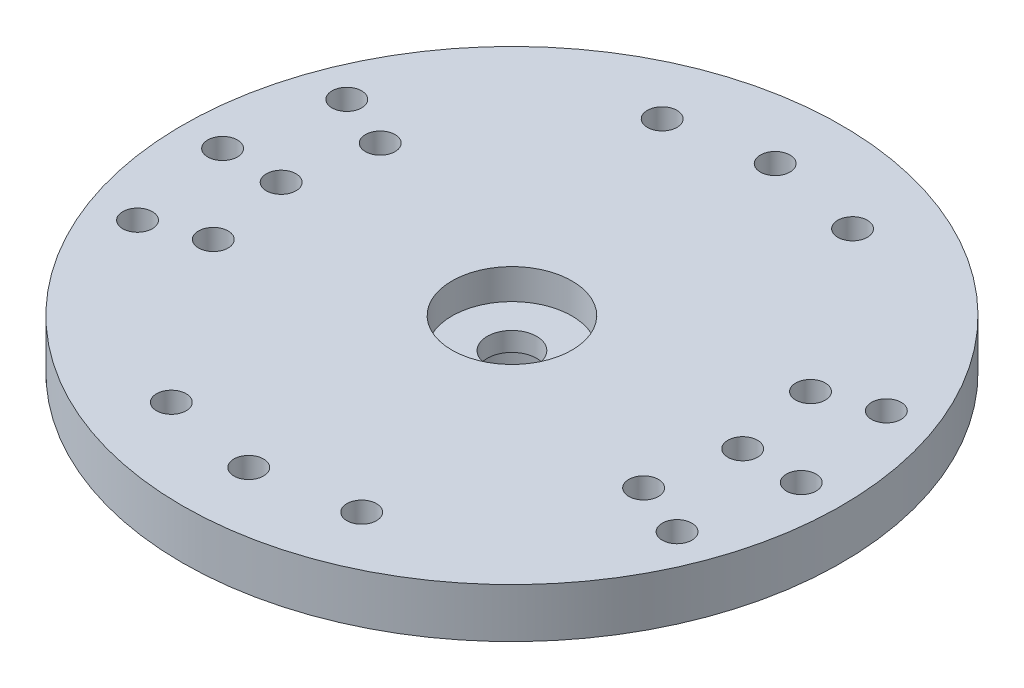
ISO-10303-21;
HEADER;
FILE_DESCRIPTION(('STEP AP214'),'2;1');
FILE_NAME('part.step','',(''),(''),'','','');
FILE_SCHEMA(('AUTOMOTIVE_DESIGN { 1 0 10303 214 1 1 1 1 }'));
ENDSEC;
DATA;
#1=APPLICATION_CONTEXT('core data for automotive mechanical design processes');
#2=APPLICATION_PROTOCOL_DEFINITION('international standard','automotive_design',2000,#1);
#3=PRODUCT_CONTEXT('',#1,'mechanical');
#4=PRODUCT('Part','Part','',(#3));
#5=PRODUCT_RELATED_PRODUCT_CATEGORY('part','',(#4));
#6=PRODUCT_DEFINITION_FORMATION('','',#4);
#7=PRODUCT_DEFINITION_CONTEXT('part definition',#1,'design');
#8=PRODUCT_DEFINITION('design','',#6,#7);
#9=PRODUCT_DEFINITION_SHAPE('','',#8);
#10=(LENGTH_UNIT() NAMED_UNIT(*) SI_UNIT(.MILLI.,.METRE.));
#11=(NAMED_UNIT(*) PLANE_ANGLE_UNIT() SI_UNIT($,.RADIAN.));
#12=(NAMED_UNIT(*) SI_UNIT($,.STERADIAN.) SOLID_ANGLE_UNIT());
#13=UNCERTAINTY_MEASURE_WITH_UNIT(LENGTH_MEASURE(1.E-05),#10,'distance_accuracy_value','');
#14=(GEOMETRIC_REPRESENTATION_CONTEXT(3) GLOBAL_UNCERTAINTY_ASSIGNED_CONTEXT((#13)) GLOBAL_UNIT_ASSIGNED_CONTEXT((#10,
#11,#12)) REPRESENTATION_CONTEXT('',''));
#15=CARTESIAN_POINT('',(0.,0.,0.));
#16=DIRECTION('',(0.,0.,1.));
#17=DIRECTION('',(1.,0.,0.));
#18=AXIS2_PLACEMENT_3D('',#15,#16,#17);
#19=CARTESIAN_POINT('',(0.,0.,0.));
#20=DIRECTION('',(0.,1.,0.));
#21=DIRECTION('',(0.,0.,1.));
#22=AXIS2_PLACEMENT_3D('',#19,#20,#21);
#23=PLANE('',#22);
#24=CARTESIAN_POINT('',(0.,0.,9.4742));
#25=DIRECTION('',(0.,1.,0.));
#26=DIRECTION('',(0.,0.,1.));
#27=AXIS2_PLACEMENT_3D('',#24,#25,#26);
#28=CIRCLE('',#27,0.5334);
#29=CARTESIAN_POINT('',(0.,0.,10.0076));
#30=VERTEX_POINT('',#29);
#31=EDGE_CURVE('E164',#30,#30,#28,.F.);
#32=ORIENTED_EDGE('',*,*,#31,.F.);
#33=EDGE_LOOP('',(#32));
#34=FACE_BOUND('',#33,.T.);
#35=CARTESIAN_POINT('',(-9.70922006586347,0.,-3.76595827282167));
#36=DIRECTION('',(0.,1.,0.));
#37=DIRECTION('',(0.,0.,1.));
#38=AXIS2_PLACEMENT_3D('',#35,#36,#37);
#39=CIRCLE('',#38,0.533399999999999);
#40=CARTESIAN_POINT('',(-9.70922006586347,0.,-3.23255827282167));
#41=VERTEX_POINT('',#40);
#42=EDGE_CURVE('E98',#41,#41,#39,.F.);
#43=ORIENTED_EDGE('',*,*,#42,.F.);
#44=EDGE_LOOP('',(#43));
#45=FACE_BOUND('',#44,.T.);
#46=CARTESIAN_POINT('',(-8.3058,0.,0.));
#47=DIRECTION('',(0.,1.,0.));
#48=DIRECTION('',(0.,0.,1.));
#49=AXIS2_PLACEMENT_3D('',#46,#47,#48);
#50=CIRCLE('',#49,0.5334);
#51=CARTESIAN_POINT('',(-8.3058,0.,0.5334));
#52=VERTEX_POINT('',#51);
#53=EDGE_CURVE('E86',#52,#52,#50,.F.);
#54=ORIENTED_EDGE('',*,*,#53,.F.);
#55=EDGE_LOOP('',(#54));
#56=FACE_BOUND('',#55,.T.);
#57=CARTESIAN_POINT('',(-9.7092200658532,0.,3.76595827284817));
#58=DIRECTION('',(0.,1.,0.));
#59=DIRECTION('',(0.,0.,1.));
#60=AXIS2_PLACEMENT_3D('',#57,#58,#59);
#61=CIRCLE('',#60,0.5334);
#62=CARTESIAN_POINT('',(-9.7092200658532,0.,4.29935827284817));
#63=VERTEX_POINT('',#62);
#64=EDGE_CURVE('E74',#63,#63,#61,.F.);
#65=ORIENTED_EDGE('',*,*,#64,.F.);
#66=EDGE_LOOP('',(#65));
#67=FACE_BOUND('',#66,.T.);
#68=CARTESIAN_POINT('',(0.,0.,0.));
#69=DIRECTION('',(0.,1.,0.));
#70=DIRECTION('',(0.,0.,1.));
#71=AXIS2_PLACEMENT_3D('',#68,#69,#70);
#72=CIRCLE('',#71,3.4417);
#73=CARTESIAN_POINT('',(0.,0.,3.4417));
#74=VERTEX_POINT('',#73);
#75=EDGE_CURVE('E10',#74,#74,#72,.F.);
#76=ORIENTED_EDGE('',*,*,#75,.F.);
#77=EDGE_LOOP('',(#76));
#78=FACE_BOUND('',#77,.T.);
#79=CARTESIAN_POINT('',(0.,0.,0.));
#80=DIRECTION('',(0.,1.,0.));
#81=DIRECTION('',(0.,0.,1.));
#82=AXIS2_PLACEMENT_3D('',#79,#80,#81);
#83=CIRCLE('',#82,11.8618);
#84=CARTESIAN_POINT('',(0.,0.,11.8618));
#85=VERTEX_POINT('',#84);
#86=EDGE_CURVE('E41',#85,#85,#83,.T.);
#87=ORIENTED_EDGE('',*,*,#86,.F.);
#88=EDGE_LOOP('',(#87));
#89=FACE_BOUND('',#88,.T.);
#90=CARTESIAN_POINT('',(-10.414,0.,0.));
#91=DIRECTION('',(0.,1.,0.));
#92=DIRECTION('',(0.,0.,1.));
#93=AXIS2_PLACEMENT_3D('',#90,#91,#92);
#94=CIRCLE('',#93,0.5334);
#95=CARTESIAN_POINT('',(-10.414,0.,0.5334));
#96=VERTEX_POINT('',#95);
#97=EDGE_CURVE('E64',#96,#96,#94,.F.);
#98=ORIENTED_EDGE('',*,*,#97,.F.);
#99=EDGE_LOOP('',(#98));
#100=FACE_BOUND('',#99,.T.);
#101=CARTESIAN_POINT('',(-7.74369502813066,0.,3.0035813542011));
#102=DIRECTION('',(0.,1.,0.));
#103=DIRECTION('',(0.,0.,1.));
#104=AXIS2_PLACEMENT_3D('',#101,#102,#103);
#105=CIRCLE('',#104,0.5334);
#106=CARTESIAN_POINT('',(-7.74369502813066,0.,3.5369813542011));
#107=VERTEX_POINT('',#106);
#108=EDGE_CURVE('E80',#107,#107,#105,.F.);
#109=ORIENTED_EDGE('',*,*,#108,.F.);
#110=EDGE_LOOP('',(#109));
#111=FACE_BOUND('',#110,.T.);
#112=CARTESIAN_POINT('',(-7.74369502814094,0.,-3.0035813541746));
#113=DIRECTION('',(0.,1.,0.));
#114=DIRECTION('',(0.,0.,1.));
#115=AXIS2_PLACEMENT_3D('',#112,#113,#114);
#116=CIRCLE('',#115,0.5334);
#117=CARTESIAN_POINT('',(-7.74369502814094,0.,-2.4701813541746));
#118=VERTEX_POINT('',#117);
#119=EDGE_CURVE('E92',#118,#118,#116,.F.);
#120=ORIENTED_EDGE('',*,*,#119,.F.);
#121=EDGE_LOOP('',(#120));
#122=FACE_BOUND('',#121,.T.);
#123=CARTESIAN_POINT('',(-3.42578011314545,0.,-8.83314758488599));
#124=DIRECTION('',(0.,1.,0.));
#125=DIRECTION('',(0.,0.,1.));
#126=AXIS2_PLACEMENT_3D('',#123,#124,#125);
#127=CIRCLE('',#126,0.533400000000001);
#128=CARTESIAN_POINT('',(-3.42578011314545,0.,-8.29974758488599));
#129=VERTEX_POINT('',#128);
#130=EDGE_CURVE('E104',#129,#129,#127,.T.);
#131=ORIENTED_EDGE('',*,*,#130,.T.);
#132=EDGE_LOOP('',(#131));
#133=FACE_BOUND('',#132,.T.);
#134=CARTESIAN_POINT('',(0.,0.,-9.4742));
#135=DIRECTION('',(0.,1.,0.));
#136=DIRECTION('',(0.,0.,1.));
#137=AXIS2_PLACEMENT_3D('',#134,#135,#136);
#138=CIRCLE('',#137,0.5334);
#139=CARTESIAN_POINT('',(0.,0.,-8.9408));
#140=VERTEX_POINT('',#139);
#141=EDGE_CURVE('E110',#140,#140,#138,.T.);
#142=ORIENTED_EDGE('',*,*,#141,.T.);
#143=EDGE_LOOP('',(#142));
#144=FACE_BOUND('',#143,.T.);
#145=CARTESIAN_POINT('',(3.42578011314545,0.,-8.83314758488599));
#146=DIRECTION('',(0.,1.,0.));
#147=DIRECTION('',(0.,0.,1.));
#148=AXIS2_PLACEMENT_3D('',#145,#146,#147);
#149=CIRCLE('',#148,0.533400000000001);
#150=CARTESIAN_POINT('',(3.42578011314545,0.,-8.29974758488599));
#151=VERTEX_POINT('',#150);
#152=EDGE_CURVE('E116',#151,#151,#149,.T.);
#153=ORIENTED_EDGE('',*,*,#152,.T.);
#154=EDGE_LOOP('',(#153));
#155=FACE_BOUND('',#154,.T.);
#156=CARTESIAN_POINT('',(7.74369502814094,0.,-3.0035813541746));
#157=DIRECTION('',(0.,1.,0.));
#158=DIRECTION('',(0.,0.,1.));
#159=AXIS2_PLACEMENT_3D('',#156,#157,#158);
#160=CIRCLE('',#159,0.5334);
#161=CARTESIAN_POINT('',(7.74369502814094,0.,-2.4701813541746));
#162=VERTEX_POINT('',#161);
#163=EDGE_CURVE('E122',#162,#162,#160,.T.);
#164=ORIENTED_EDGE('',*,*,#163,.T.);
#165=EDGE_LOOP('',(#164));
#166=FACE_BOUND('',#165,.T.);
#167=CARTESIAN_POINT('',(9.70922006586347,0.,-3.76595827282167));
#168=DIRECTION('',(0.,1.,0.));
#169=DIRECTION('',(0.,0.,1.));
#170=AXIS2_PLACEMENT_3D('',#167,#168,#169);
#171=CIRCLE('',#170,0.533399999999999);
#172=CARTESIAN_POINT('',(9.70922006586347,0.,-3.23255827282167));
#173=VERTEX_POINT('',#172);
#174=EDGE_CURVE('E128',#173,#173,#171,.T.);
#175=ORIENTED_EDGE('',*,*,#174,.T.);
#176=EDGE_LOOP('',(#175));
#177=FACE_BOUND('',#176,.T.);
#178=CARTESIAN_POINT('',(10.414,0.,0.));
#179=DIRECTION('',(0.,1.,0.));
#180=DIRECTION('',(0.,0.,1.));
#181=AXIS2_PLACEMENT_3D('',#178,#179,#180);
#182=CIRCLE('',#181,0.5334);
#183=CARTESIAN_POINT('',(10.414,0.,0.5334));
#184=VERTEX_POINT('',#183);
#185=EDGE_CURVE('E134',#184,#184,#182,.T.);
#186=ORIENTED_EDGE('',*,*,#185,.T.);
#187=EDGE_LOOP('',(#186));
#188=FACE_BOUND('',#187,.T.);
#189=CARTESIAN_POINT('',(8.3058,0.,0.));
#190=DIRECTION('',(0.,1.,0.));
#191=DIRECTION('',(0.,0.,1.));
#192=AXIS2_PLACEMENT_3D('',#189,#190,#191);
#193=CIRCLE('',#192,0.5334);
#194=CARTESIAN_POINT('',(8.3058,0.,0.5334));
#195=VERTEX_POINT('',#194);
#196=EDGE_CURVE('E140',#195,#195,#193,.T.);
#197=ORIENTED_EDGE('',*,*,#196,.T.);
#198=EDGE_LOOP('',(#197));
#199=FACE_BOUND('',#198,.T.);
#200=CARTESIAN_POINT('',(7.74369502813066,0.,3.0035813542011));
#201=DIRECTION('',(0.,1.,0.));
#202=DIRECTION('',(0.,0.,1.));
#203=AXIS2_PLACEMENT_3D('',#200,#201,#202);
#204=CIRCLE('',#203,0.5334);
#205=CARTESIAN_POINT('',(7.74369502813066,0.,3.5369813542011));
#206=VERTEX_POINT('',#205);
#207=EDGE_CURVE('E146',#206,#206,#204,.T.);
#208=ORIENTED_EDGE('',*,*,#207,.T.);
#209=EDGE_LOOP('',(#208));
#210=FACE_BOUND('',#209,.T.);
#211=CARTESIAN_POINT('',(9.7092200658532,0.,3.76595827284817));
#212=DIRECTION('',(0.,1.,0.));
#213=DIRECTION('',(0.,0.,1.));
#214=AXIS2_PLACEMENT_3D('',#211,#212,#213);
#215=CIRCLE('',#214,0.5334);
#216=CARTESIAN_POINT('',(9.7092200658532,0.,4.29935827284817));
#217=VERTEX_POINT('',#216);
#218=EDGE_CURVE('E152',#217,#217,#215,.T.);
#219=ORIENTED_EDGE('',*,*,#218,.T.);
#220=EDGE_LOOP('',(#219));
#221=FACE_BOUND('',#220,.T.);
#222=CARTESIAN_POINT('',(-3.42578011314545,0.,8.83314758488599));
#223=DIRECTION('',(0.,1.,0.));
#224=DIRECTION('',(0.,0.,1.));
#225=AXIS2_PLACEMENT_3D('',#222,#223,#224);
#226=CIRCLE('',#225,0.533400000000001);
#227=CARTESIAN_POINT('',(-3.42578011314545,0.,9.36654758488599));
#228=VERTEX_POINT('',#227);
#229=EDGE_CURVE('E158',#228,#228,#226,.F.);
#230=ORIENTED_EDGE('',*,*,#229,.F.);
#231=EDGE_LOOP('',(#230));
#232=FACE_BOUND('',#231,.T.);
#233=CARTESIAN_POINT('',(3.42578011314545,0.,8.83314758488599));
#234=DIRECTION('',(0.,1.,0.));
#235=DIRECTION('',(0.,0.,1.));
#236=AXIS2_PLACEMENT_3D('',#233,#234,#235);
#237=CIRCLE('',#236,0.533400000000001);
#238=CARTESIAN_POINT('',(3.42578011314545,0.,9.36654758488599));
#239=VERTEX_POINT('',#238);
#240=EDGE_CURVE('E170',#239,#239,#237,.F.);
#241=ORIENTED_EDGE('',*,*,#240,.F.);
#242=EDGE_LOOP('',(#241));
#243=FACE_BOUND('',#242,.T.);
#244=ADVANCED_FACE('F30',(#34,#45,#56,#67,#78,#89,#100,#111,#122,#133,#144,#155,#166,#177,#188,
#199,#210,#221,#232,#243),#23,.F.);
#245=CARTESIAN_POINT('',(0.,1.778,0.));
#246=DIRECTION('',(0.,1.,0.));
#247=DIRECTION('',(0.,0.,1.));
#248=AXIS2_PLACEMENT_3D('',#245,#246,#247);
#249=PLANE('',#248);
#250=CARTESIAN_POINT('',(0.,1.778,9.4742));
#251=DIRECTION('',(0.,-1.,0.));
#252=DIRECTION('',(0.,0.,-1.));
#253=AXIS2_PLACEMENT_3D('',#250,#251,#252);
#254=CIRCLE('',#253,0.5334);
#255=CARTESIAN_POINT('',(0.,1.778,8.9408));
#256=VERTEX_POINT('',#255);
#257=EDGE_CURVE('E167',#256,#256,#254,.T.);
#258=ORIENTED_EDGE('',*,*,#257,.T.);
#259=EDGE_LOOP('',(#258));
#260=FACE_BOUND('',#259,.T.);
#261=CARTESIAN_POINT('',(-9.70922006586347,1.778,-3.76595827282167));
#262=DIRECTION('',(0.,-1.,0.));
#263=DIRECTION('',(0.,0.,-1.));
#264=AXIS2_PLACEMENT_3D('',#261,#262,#263);
#265=CIRCLE('',#264,0.533399999999999);
#266=CARTESIAN_POINT('',(-9.70922006586347,1.778,-4.29935827282167));
#267=VERTEX_POINT('',#266);
#268=EDGE_CURVE('E101',#267,#267,#265,.T.);
#269=ORIENTED_EDGE('',*,*,#268,.T.);
#270=EDGE_LOOP('',(#269));
#271=FACE_BOUND('',#270,.T.);
#272=CARTESIAN_POINT('',(-8.3058,1.778,0.));
#273=DIRECTION('',(0.,-1.,0.));
#274=DIRECTION('',(0.,0.,-1.));
#275=AXIS2_PLACEMENT_3D('',#272,#273,#274);
#276=CIRCLE('',#275,0.5334);
#277=CARTESIAN_POINT('',(-8.3058,1.778,-0.5334));
#278=VERTEX_POINT('',#277);
#279=EDGE_CURVE('E89',#278,#278,#276,.T.);
#280=ORIENTED_EDGE('',*,*,#279,.T.);
#281=EDGE_LOOP('',(#280));
#282=FACE_BOUND('',#281,.T.);
#283=CARTESIAN_POINT('',(-9.7092200658532,1.778,3.76595827284817));
#284=DIRECTION('',(0.,-1.,0.));
#285=DIRECTION('',(0.,0.,-1.));
#286=AXIS2_PLACEMENT_3D('',#283,#284,#285);
#287=CIRCLE('',#286,0.5334);
#288=CARTESIAN_POINT('',(-9.7092200658532,1.778,3.23255827284817));
#289=VERTEX_POINT('',#288);
#290=EDGE_CURVE('E77',#289,#289,#287,.T.);
#291=ORIENTED_EDGE('',*,*,#290,.T.);
#292=EDGE_LOOP('',(#291));
#293=FACE_BOUND('',#292,.T.);
#294=CARTESIAN_POINT('',(0.,1.778,0.));
#295=DIRECTION('',(0.,1.,0.));
#296=DIRECTION('',(0.,0.,1.));
#297=AXIS2_PLACEMENT_3D('',#294,#295,#296);
#298=CIRCLE('',#297,11.8618);
#299=CARTESIAN_POINT('',(0.,1.778,11.8618));
#300=VERTEX_POINT('',#299);
#301=EDGE_CURVE('E37',#300,#300,#298,.T.);
#302=ORIENTED_EDGE('',*,*,#301,.T.);
#303=EDGE_LOOP('',(#302));
#304=FACE_BOUND('',#303,.T.);
#305=CARTESIAN_POINT('',(0.,1.778,0.));
#306=DIRECTION('',(0.,1.,0.));
#307=DIRECTION('',(0.,0.,1.));
#308=AXIS2_PLACEMENT_3D('',#305,#306,#307);
#309=CIRCLE('',#308,2.159);
#310=CARTESIAN_POINT('',(0.,1.778,2.159));
#311=VERTEX_POINT('',#310);
#312=EDGE_CURVE('E60',#311,#311,#309,.T.);
#313=ORIENTED_EDGE('',*,*,#312,.F.);
#314=EDGE_LOOP('',(#313));
#315=FACE_BOUND('',#314,.T.);
#316=CARTESIAN_POINT('',(-10.414,1.778,0.));
#317=DIRECTION('',(0.,-1.,0.));
#318=DIRECTION('',(0.,0.,-1.));
#319=AXIS2_PLACEMENT_3D('',#316,#317,#318);
#320=CIRCLE('',#319,0.5334);
#321=CARTESIAN_POINT('',(-10.414,1.778,-0.5334));
#322=VERTEX_POINT('',#321);
#323=EDGE_CURVE('E71',#322,#322,#320,.T.);
#324=ORIENTED_EDGE('',*,*,#323,.T.);
#325=EDGE_LOOP('',(#324));
#326=FACE_BOUND('',#325,.T.);
#327=CARTESIAN_POINT('',(-7.74369502813066,1.778,3.0035813542011));
#328=DIRECTION('',(0.,-1.,0.));
#329=DIRECTION('',(0.,0.,-1.));
#330=AXIS2_PLACEMENT_3D('',#327,#328,#329);
#331=CIRCLE('',#330,0.5334);
#332=CARTESIAN_POINT('',(-7.74369502813066,1.778,2.4701813542011));
#333=VERTEX_POINT('',#332);
#334=EDGE_CURVE('E83',#333,#333,#331,.T.);
#335=ORIENTED_EDGE('',*,*,#334,.T.);
#336=EDGE_LOOP('',(#335));
#337=FACE_BOUND('',#336,.T.);
#338=CARTESIAN_POINT('',(-7.74369502814094,1.778,-3.0035813541746));
#339=DIRECTION('',(0.,-1.,0.));
#340=DIRECTION('',(0.,0.,-1.));
#341=AXIS2_PLACEMENT_3D('',#338,#339,#340);
#342=CIRCLE('',#341,0.5334);
#343=CARTESIAN_POINT('',(-7.74369502814094,1.778,-3.5369813541746));
#344=VERTEX_POINT('',#343);
#345=EDGE_CURVE('E95',#344,#344,#342,.T.);
#346=ORIENTED_EDGE('',*,*,#345,.T.);
#347=EDGE_LOOP('',(#346));
#348=FACE_BOUND('',#347,.T.);
#349=CARTESIAN_POINT('',(-3.42578011314545,1.778,-8.83314758488599));
#350=DIRECTION('',(0.,1.,0.));
#351=DIRECTION('',(0.,0.,1.));
#352=AXIS2_PLACEMENT_3D('',#349,#350,#351);
#353=CIRCLE('',#352,0.533400000000001);
#354=CARTESIAN_POINT('',(-3.42578011314545,1.778,-8.29974758488599));
#355=VERTEX_POINT('',#354);
#356=EDGE_CURVE('E107',#355,#355,#353,.T.);
#357=ORIENTED_EDGE('',*,*,#356,.F.);
#358=EDGE_LOOP('',(#357));
#359=FACE_BOUND('',#358,.T.);
#360=CARTESIAN_POINT('',(0.,1.778,-9.4742));
#361=DIRECTION('',(0.,1.,0.));
#362=DIRECTION('',(0.,0.,1.));
#363=AXIS2_PLACEMENT_3D('',#360,#361,#362);
#364=CIRCLE('',#363,0.5334);
#365=CARTESIAN_POINT('',(0.,1.778,-8.9408));
#366=VERTEX_POINT('',#365);
#367=EDGE_CURVE('E113',#366,#366,#364,.T.);
#368=ORIENTED_EDGE('',*,*,#367,.F.);
#369=EDGE_LOOP('',(#368));
#370=FACE_BOUND('',#369,.T.);
#371=CARTESIAN_POINT('',(3.42578011314545,1.778,-8.83314758488599));
#372=DIRECTION('',(0.,1.,0.));
#373=DIRECTION('',(0.,0.,1.));
#374=AXIS2_PLACEMENT_3D('',#371,#372,#373);
#375=CIRCLE('',#374,0.533400000000001);
#376=CARTESIAN_POINT('',(3.42578011314545,1.778,-8.29974758488599));
#377=VERTEX_POINT('',#376);
#378=EDGE_CURVE('E119',#377,#377,#375,.T.);
#379=ORIENTED_EDGE('',*,*,#378,.F.);
#380=EDGE_LOOP('',(#379));
#381=FACE_BOUND('',#380,.T.);
#382=CARTESIAN_POINT('',(7.74369502814094,1.778,-3.0035813541746));
#383=DIRECTION('',(0.,1.,0.));
#384=DIRECTION('',(0.,0.,1.));
#385=AXIS2_PLACEMENT_3D('',#382,#383,#384);
#386=CIRCLE('',#385,0.5334);
#387=CARTESIAN_POINT('',(7.74369502814094,1.778,-2.4701813541746));
#388=VERTEX_POINT('',#387);
#389=EDGE_CURVE('E125',#388,#388,#386,.T.);
#390=ORIENTED_EDGE('',*,*,#389,.F.);
#391=EDGE_LOOP('',(#390));
#392=FACE_BOUND('',#391,.T.);
#393=CARTESIAN_POINT('',(9.70922006586347,1.778,-3.76595827282167));
#394=DIRECTION('',(0.,1.,0.));
#395=DIRECTION('',(0.,0.,1.));
#396=AXIS2_PLACEMENT_3D('',#393,#394,#395);
#397=CIRCLE('',#396,0.533399999999999);
#398=CARTESIAN_POINT('',(9.70922006586347,1.778,-3.23255827282167));
#399=VERTEX_POINT('',#398);
#400=EDGE_CURVE('E131',#399,#399,#397,.T.);
#401=ORIENTED_EDGE('',*,*,#400,.F.);
#402=EDGE_LOOP('',(#401));
#403=FACE_BOUND('',#402,.T.);
#404=CARTESIAN_POINT('',(10.414,1.778,0.));
#405=DIRECTION('',(0.,1.,0.));
#406=DIRECTION('',(0.,0.,1.));
#407=AXIS2_PLACEMENT_3D('',#404,#405,#406);
#408=CIRCLE('',#407,0.5334);
#409=CARTESIAN_POINT('',(10.414,1.778,0.5334));
#410=VERTEX_POINT('',#409);
#411=EDGE_CURVE('E137',#410,#410,#408,.T.);
#412=ORIENTED_EDGE('',*,*,#411,.F.);
#413=EDGE_LOOP('',(#412));
#414=FACE_BOUND('',#413,.T.);
#415=CARTESIAN_POINT('',(8.3058,1.778,0.));
#416=DIRECTION('',(0.,1.,0.));
#417=DIRECTION('',(0.,0.,1.));
#418=AXIS2_PLACEMENT_3D('',#415,#416,#417);
#419=CIRCLE('',#418,0.5334);
#420=CARTESIAN_POINT('',(8.3058,1.778,0.5334));
#421=VERTEX_POINT('',#420);
#422=EDGE_CURVE('E143',#421,#421,#419,.T.);
#423=ORIENTED_EDGE('',*,*,#422,.F.);
#424=EDGE_LOOP('',(#423));
#425=FACE_BOUND('',#424,.T.);
#426=CARTESIAN_POINT('',(7.74369502813066,1.778,3.0035813542011));
#427=DIRECTION('',(0.,1.,0.));
#428=DIRECTION('',(0.,0.,1.));
#429=AXIS2_PLACEMENT_3D('',#426,#427,#428);
#430=CIRCLE('',#429,0.5334);
#431=CARTESIAN_POINT('',(7.74369502813066,1.778,3.5369813542011));
#432=VERTEX_POINT('',#431);
#433=EDGE_CURVE('E149',#432,#432,#430,.T.);
#434=ORIENTED_EDGE('',*,*,#433,.F.);
#435=EDGE_LOOP('',(#434));
#436=FACE_BOUND('',#435,.T.);
#437=CARTESIAN_POINT('',(9.7092200658532,1.778,3.76595827284817));
#438=DIRECTION('',(0.,1.,0.));
#439=DIRECTION('',(0.,0.,1.));
#440=AXIS2_PLACEMENT_3D('',#437,#438,#439);
#441=CIRCLE('',#440,0.5334);
#442=CARTESIAN_POINT('',(9.7092200658532,1.778,4.29935827284817));
#443=VERTEX_POINT('',#442);
#444=EDGE_CURVE('E155',#443,#443,#441,.T.);
#445=ORIENTED_EDGE('',*,*,#444,.F.);
#446=EDGE_LOOP('',(#445));
#447=FACE_BOUND('',#446,.T.);
#448=CARTESIAN_POINT('',(-3.42578011314545,1.778,8.83314758488599));
#449=DIRECTION('',(0.,-1.,0.));
#450=DIRECTION('',(0.,0.,-1.));
#451=AXIS2_PLACEMENT_3D('',#448,#449,#450);
#452=CIRCLE('',#451,0.533400000000001);
#453=CARTESIAN_POINT('',(-3.42578011314545,1.778,8.29974758488599));
#454=VERTEX_POINT('',#453);
#455=EDGE_CURVE('E161',#454,#454,#452,.T.);
#456=ORIENTED_EDGE('',*,*,#455,.T.);
#457=EDGE_LOOP('',(#456));
#458=FACE_BOUND('',#457,.T.);
#459=CARTESIAN_POINT('',(3.42578011314545,1.778,8.83314758488599));
#460=DIRECTION('',(0.,-1.,0.));
#461=DIRECTION('',(0.,0.,-1.));
#462=AXIS2_PLACEMENT_3D('',#459,#460,#461);
#463=CIRCLE('',#462,0.533400000000001);
#464=CARTESIAN_POINT('',(3.42578011314545,1.778,8.29974758488599));
#465=VERTEX_POINT('',#464);
#466=EDGE_CURVE('E173',#465,#465,#463,.T.);
#467=ORIENTED_EDGE('',*,*,#466,.T.);
#468=EDGE_LOOP('',(#467));
#469=FACE_BOUND('',#468,.T.);
#470=ADVANCED_FACE('F177',(#260,#271,#282,#293,#304,#315,#326,#337,#348,#359,#370,#381,#392,
#403,#414,#425,#436,#447,#458,#469),#249,.T.);
#471=CARTESIAN_POINT('',(0.,1.778,0.));
#472=DIRECTION('',(0.,-1.,0.));
#473=DIRECTION('',(0.,0.,-1.));
#474=AXIS2_PLACEMENT_3D('',#471,#472,#473);
#475=CYLINDRICAL_SURFACE('',#474,0.889);
#476=CARTESIAN_POINT('',(0.,0.,0.));
#477=DIRECTION('',(0.,1.,0.));
#478=DIRECTION('',(0.,0.,1.));
#479=AXIS2_PLACEMENT_3D('',#476,#477,#478);
#480=CIRCLE('',#479,0.889);
#481=CARTESIAN_POINT('',(0.,0.,0.889));
#482=VERTEX_POINT('',#481);
#483=EDGE_CURVE('E46',#482,#482,#480,.T.);
#484=ORIENTED_EDGE('',*,*,#483,.F.);
#485=EDGE_LOOP('',(#484));
#486=FACE_BOUND('',#485,.T.);
#487=CARTESIAN_POINT('',(0.,0.6858,0.));
#488=DIRECTION('',(0.,1.,0.));
#489=DIRECTION('',(0.,0.,1.));
#490=AXIS2_PLACEMENT_3D('',#487,#488,#489);
#491=CIRCLE('',#490,0.889);
#492=CARTESIAN_POINT('',(0.,0.6858,0.889));
#493=VERTEX_POINT('',#492);
#494=EDGE_CURVE('E63',#493,#493,#491,.F.);
#495=ORIENTED_EDGE('',*,*,#494,.F.);
#496=EDGE_LOOP('',(#495));
#497=FACE_BOUND('',#496,.T.);
#498=ADVANCED_FACE('F192',(#486,#497),#475,.F.);
#499=CARTESIAN_POINT('',(0.,0.,0.));
#500=DIRECTION('',(0.,-1.,0.));
#501=DIRECTION('',(0.,0.,-1.));
#502=AXIS2_PLACEMENT_3D('',#499,#500,#501);
#503=CIRCLE('',#502,2.19075);
#504=CARTESIAN_POINT('',(0.,0.,2.19075));
#505=VERTEX_POINT('',#504);
#506=EDGE_CURVE('E54',#505,#505,#503,.T.);
#507=ORIENTED_EDGE('',*,*,#506,.T.);
#508=EDGE_LOOP('',(#507));
#509=FACE_BOUND('',#508,.T.);
#510=ORIENTED_EDGE('',*,*,#483,.T.);
#511=EDGE_LOOP('',(#510));
#512=FACE_BOUND('',#511,.T.);
#513=ADVANCED_FACE('F188',(#509,#512),#23,.F.);
#514=CARTESIAN_POINT('',(0.,1.778,0.));
#515=DIRECTION('',(0.,-1.,0.));
#516=DIRECTION('',(0.,0.,-1.));
#517=AXIS2_PLACEMENT_3D('',#514,#515,#516);
#518=CYLINDRICAL_SURFACE('',#517,11.8618);
#519=ORIENTED_EDGE('',*,*,#301,.F.);
#520=EDGE_LOOP('',(#519));
#521=FACE_BOUND('',#520,.T.);
#522=ORIENTED_EDGE('',*,*,#86,.T.);
#523=EDGE_LOOP('',(#522));
#524=FACE_BOUND('',#523,.T.);
#525=ADVANCED_FACE('F32',(#521,#524),#518,.T.);
#526=CARTESIAN_POINT('',(0.,-3.048,0.));
#527=DIRECTION('',(0.,-1.,0.));
#528=DIRECTION('',(0.,0.,-1.));
#529=AXIS2_PLACEMENT_3D('',#526,#527,#528);
#530=PLANE('',#529);
#531=CARTESIAN_POINT('',(0.,-3.048,0.));
#532=DIRECTION('',(0.,-1.,0.));
#533=DIRECTION('',(0.,0.,-1.));
#534=AXIS2_PLACEMENT_3D('',#531,#532,#533);
#535=CIRCLE('',#534,3.4417);
#536=CARTESIAN_POINT('',(0.,-3.048,3.4417));
#537=VERTEX_POINT('',#536);
#538=EDGE_CURVE('E50',#537,#537,#535,.T.);
#539=ORIENTED_EDGE('',*,*,#538,.T.);
#540=EDGE_LOOP('',(#539));
#541=FACE_BOUND('',#540,.T.);
#542=CARTESIAN_POINT('',(0.,-3.048,0.));
#543=DIRECTION('',(0.,-1.,0.));
#544=DIRECTION('',(0.,0.,-1.));
#545=AXIS2_PLACEMENT_3D('',#542,#543,#544);
#546=CIRCLE('',#545,2.19075);
#547=CARTESIAN_POINT('',(0.,-3.048,2.19075));
#548=VERTEX_POINT('',#547);
#549=EDGE_CURVE('E53',#548,#548,#546,.T.);
#550=ORIENTED_EDGE('',*,*,#549,.F.);
#551=EDGE_LOOP('',(#550));
#552=FACE_BOUND('',#551,.T.);
#553=ADVANCED_FACE('F203',(#541,#552),#530,.T.);
#554=CARTESIAN_POINT('',(0.,-3.048,0.));
#555=DIRECTION('',(0.,1.,0.));
#556=DIRECTION('',(0.,0.,1.));
#557=AXIS2_PLACEMENT_3D('',#554,#555,#556);
#558=CYLINDRICAL_SURFACE('',#557,3.4417);
#559=CARTESIAN_POINT('',(0.,-3.048,3.4417));
#560=CARTESIAN_POINT('',(0.,-3.01625,3.4417));
#561=CARTESIAN_POINT('',(0.,-2.9845,3.4417));
#562=CARTESIAN_POINT('',(0.,-2.921,3.4417));
#563=CARTESIAN_POINT('',(0.,-2.88925,3.4417));
#564=CARTESIAN_POINT('',(0.,-2.82575,3.4417));
#565=CARTESIAN_POINT('',(0.,-2.794,3.4417));
#566=CARTESIAN_POINT('',(0.,-2.7305,3.4417));
#567=CARTESIAN_POINT('',(0.,-2.69875,3.4417));
#568=CARTESIAN_POINT('',(0.,-2.63525,3.4417));
#569=CARTESIAN_POINT('',(0.,-2.6035,3.4417));
#570=CARTESIAN_POINT('',(0.,-2.54,3.4417));
#571=CARTESIAN_POINT('',(0.,-2.50825,3.4417));
#572=CARTESIAN_POINT('',(0.,-2.44475,3.4417));
#573=CARTESIAN_POINT('',(0.,-2.413,3.4417));
#574=CARTESIAN_POINT('',(0.,-2.3495,3.4417));
#575=CARTESIAN_POINT('',(0.,-2.31775,3.4417));
#576=CARTESIAN_POINT('',(0.,-2.25425,3.4417));
#577=CARTESIAN_POINT('',(0.,-2.2225,3.4417));
#578=CARTESIAN_POINT('',(0.,-2.159,3.4417));
#579=CARTESIAN_POINT('',(0.,-2.12725,3.4417));
#580=CARTESIAN_POINT('',(0.,-2.06375,3.4417));
#581=CARTESIAN_POINT('',(0.,-2.032,3.4417));
#582=CARTESIAN_POINT('',(0.,-1.9685,3.4417));
#583=CARTESIAN_POINT('',(0.,-1.93675,3.4417));
#584=CARTESIAN_POINT('',(0.,-1.87325,3.4417));
#585=CARTESIAN_POINT('',(0.,-1.8415,3.4417));
#586=CARTESIAN_POINT('',(0.,-1.778,3.4417));
#587=CARTESIAN_POINT('',(0.,-1.74625,3.4417));
#588=CARTESIAN_POINT('',(0.,-1.68275,3.4417));
#589=CARTESIAN_POINT('',(0.,-1.651,3.4417));
#590=CARTESIAN_POINT('',(0.,-1.5875,3.4417));
#591=CARTESIAN_POINT('',(0.,-1.55575,3.4417));
#592=CARTESIAN_POINT('',(0.,-1.49225,3.4417));
#593=CARTESIAN_POINT('',(0.,-1.4605,3.4417));
#594=CARTESIAN_POINT('',(0.,-1.397,3.4417));
#595=CARTESIAN_POINT('',(0.,-1.36525,3.4417));
#596=CARTESIAN_POINT('',(0.,-1.30175,3.4417));
#597=CARTESIAN_POINT('',(0.,-1.27,3.4417));
#598=CARTESIAN_POINT('',(0.,-1.2065,3.4417));
#599=CARTESIAN_POINT('',(0.,-1.17475,3.4417));
#600=CARTESIAN_POINT('',(0.,-1.11125,3.4417));
#601=CARTESIAN_POINT('',(0.,-1.0795,3.4417));
#602=CARTESIAN_POINT('',(0.,-1.016,3.4417));
#603=CARTESIAN_POINT('',(0.,-0.98425,3.4417));
#604=CARTESIAN_POINT('',(0.,-0.92075,3.4417));
#605=CARTESIAN_POINT('',(0.,-0.889,3.4417));
#606=CARTESIAN_POINT('',(0.,-0.8255,3.4417));
#607=CARTESIAN_POINT('',(0.,-0.79375,3.4417));
#608=CARTESIAN_POINT('',(0.,-0.73025,3.4417));
#609=CARTESIAN_POINT('',(0.,-0.6985,3.4417));
#610=CARTESIAN_POINT('',(0.,-0.635,3.4417));
#611=CARTESIAN_POINT('',(0.,-0.60325,3.4417));
#612=CARTESIAN_POINT('',(0.,-0.53975,3.4417));
#613=CARTESIAN_POINT('',(0.,-0.508,3.4417));
#614=CARTESIAN_POINT('',(0.,-0.4445,3.4417));
#615=CARTESIAN_POINT('',(0.,-0.41275,3.4417));
#616=CARTESIAN_POINT('',(0.,-0.34925,3.4417));
#617=CARTESIAN_POINT('',(0.,-0.3175,3.4417));
#618=CARTESIAN_POINT('',(0.,-0.254,3.4417));
#619=CARTESIAN_POINT('',(0.,-0.22225,3.4417));
#620=CARTESIAN_POINT('',(0.,-0.15875,3.4417));
#621=CARTESIAN_POINT('',(0.,-0.127,3.4417));
#622=CARTESIAN_POINT('',(0.,-0.0634999999999999,3.4417));
#623=CARTESIAN_POINT('',(0.,-0.03175,3.4417));
#624=CARTESIAN_POINT('',(0.,0.,3.4417));
#625=B_SPLINE_CURVE_WITH_KNOTS('',3,(#559,#560,#561,#562,#563,#564,#565,#566,#567,#568,#569,
#570,#571,#572,#573,#574,#575,#576,#577,#578,#579,#580,#581,#582,#583,#584,#585,#586,#587,#588,
#589,#590,#591,#592,#593,#594,#595,#596,#597,#598,#599,#600,#601,#602,#603,#604,#605,#606,#607,
#608,#609,#610,#611,#612,#613,#614,#615,#616,#617,#618,#619,#620,#621,#622,#623,#624),
.UNSPECIFIED.,.F.,.F.,(4,2,2,2,2,2,2,2,2,2,2,2,2,2,2,2,2,2,2,2,2,2,2,2,2,2,2,2,2,2,2,2,4),(0.,
0.0952500000000003,0.1905,0.28575,0.381,0.47625,0.5715,0.66675,0.762,0.85725,0.9525,1.04775,
1.143,1.23825,1.3335,1.42875,1.524,1.61925,1.7145,1.80975,1.905,2.00025,2.0955,2.19075,2.286,
2.38125,2.4765,2.57175,2.667,2.76225,2.8575,2.95275,3.048),.UNSPECIFIED.);
#626=EDGE_CURVE('BSEAM327',#537,#74,#625,.T.);
#627=ORIENTED_EDGE('',*,*,#538,.F.);
#628=ORIENTED_EDGE('',*,*,#75,.T.);
#629=ORIENTED_EDGE('',*,*,#626,.T.);
#630=ORIENTED_EDGE('',*,*,#626,.F.);
#631=EDGE_LOOP('',(#627,#629,#628,#630));
#632=FACE_BOUND('',#631,.T.);
#633=ADVANCED_FACE('F327',(#632),#558,.T.);
#634=CARTESIAN_POINT('',(0.,-3.048,0.));
#635=DIRECTION('',(0.,1.,0.));
#636=DIRECTION('',(0.,0.,1.));
#637=AXIS2_PLACEMENT_3D('',#634,#635,#636);
#638=CYLINDRICAL_SURFACE('',#637,2.19075);
#639=CARTESIAN_POINT('',(0.,-3.048,2.19075));
#640=CARTESIAN_POINT('',(0.,-3.01625,2.19075));
#641=CARTESIAN_POINT('',(0.,-2.9845,2.19075));
#642=CARTESIAN_POINT('',(0.,-2.921,2.19075));
#643=CARTESIAN_POINT('',(0.,-2.88925,2.19075));
#644=CARTESIAN_POINT('',(0.,-2.82575,2.19075));
#645=CARTESIAN_POINT('',(0.,-2.794,2.19075));
#646=CARTESIAN_POINT('',(0.,-2.7305,2.19075));
#647=CARTESIAN_POINT('',(0.,-2.69875,2.19075));
#648=CARTESIAN_POINT('',(0.,-2.63525,2.19075));
#649=CARTESIAN_POINT('',(0.,-2.6035,2.19075));
#650=CARTESIAN_POINT('',(0.,-2.54,2.19075));
#651=CARTESIAN_POINT('',(0.,-2.50825,2.19075));
#652=CARTESIAN_POINT('',(0.,-2.44475,2.19075));
#653=CARTESIAN_POINT('',(0.,-2.413,2.19075));
#654=CARTESIAN_POINT('',(0.,-2.3495,2.19075));
#655=CARTESIAN_POINT('',(0.,-2.31775,2.19075));
#656=CARTESIAN_POINT('',(0.,-2.25425,2.19075));
#657=CARTESIAN_POINT('',(0.,-2.2225,2.19075));
#658=CARTESIAN_POINT('',(0.,-2.159,2.19075));
#659=CARTESIAN_POINT('',(0.,-2.12725,2.19075));
#660=CARTESIAN_POINT('',(0.,-2.06375,2.19075));
#661=CARTESIAN_POINT('',(0.,-2.032,2.19075));
#662=CARTESIAN_POINT('',(0.,-1.9685,2.19075));
#663=CARTESIAN_POINT('',(0.,-1.93675,2.19075));
#664=CARTESIAN_POINT('',(0.,-1.87325,2.19075));
#665=CARTESIAN_POINT('',(0.,-1.8415,2.19075));
#666=CARTESIAN_POINT('',(0.,-1.778,2.19075));
#667=CARTESIAN_POINT('',(0.,-1.74625,2.19075));
#668=CARTESIAN_POINT('',(0.,-1.68275,2.19075));
#669=CARTESIAN_POINT('',(0.,-1.651,2.19075));
#670=CARTESIAN_POINT('',(0.,-1.5875,2.19075));
#671=CARTESIAN_POINT('',(0.,-1.55575,2.19075));
#672=CARTESIAN_POINT('',(0.,-1.49225,2.19075));
#673=CARTESIAN_POINT('',(0.,-1.4605,2.19075));
#674=CARTESIAN_POINT('',(0.,-1.397,2.19075));
#675=CARTESIAN_POINT('',(0.,-1.36525,2.19075));
#676=CARTESIAN_POINT('',(0.,-1.30175,2.19075));
#677=CARTESIAN_POINT('',(0.,-1.27,2.19075));
#678=CARTESIAN_POINT('',(0.,-1.2065,2.19075));
#679=CARTESIAN_POINT('',(0.,-1.17475,2.19075));
#680=CARTESIAN_POINT('',(0.,-1.11125,2.19075));
#681=CARTESIAN_POINT('',(0.,-1.0795,2.19075));
#682=CARTESIAN_POINT('',(0.,-1.016,2.19075));
#683=CARTESIAN_POINT('',(0.,-0.98425,2.19075));
#684=CARTESIAN_POINT('',(0.,-0.92075,2.19075));
#685=CARTESIAN_POINT('',(0.,-0.889,2.19075));
#686=CARTESIAN_POINT('',(0.,-0.8255,2.19075));
#687=CARTESIAN_POINT('',(0.,-0.79375,2.19075));
#688=CARTESIAN_POINT('',(0.,-0.73025,2.19075));
#689=CARTESIAN_POINT('',(0.,-0.6985,2.19075));
#690=CARTESIAN_POINT('',(0.,-0.635,2.19075));
#691=CARTESIAN_POINT('',(0.,-0.60325,2.19075));
#692=CARTESIAN_POINT('',(0.,-0.53975,2.19075));
#693=CARTESIAN_POINT('',(0.,-0.508,2.19075));
#694=CARTESIAN_POINT('',(0.,-0.4445,2.19075));
#695=CARTESIAN_POINT('',(0.,-0.41275,2.19075));
#696=CARTESIAN_POINT('',(0.,-0.34925,2.19075));
#697=CARTESIAN_POINT('',(0.,-0.3175,2.19075));
#698=CARTESIAN_POINT('',(0.,-0.254,2.19075));
#699=CARTESIAN_POINT('',(0.,-0.22225,2.19075));
#700=CARTESIAN_POINT('',(0.,-0.15875,2.19075));
#701=CARTESIAN_POINT('',(0.,-0.127,2.19075));
#702=CARTESIAN_POINT('',(0.,-0.0634999999999999,2.19075));
#703=CARTESIAN_POINT('',(0.,-0.03175,2.19075));
#704=CARTESIAN_POINT('',(0.,0.,2.19075));
#705=B_SPLINE_CURVE_WITH_KNOTS('',3,(#639,#640,#641,#642,#643,#644,#645,#646,#647,#648,#649,
#650,#651,#652,#653,#654,#655,#656,#657,#658,#659,#660,#661,#662,#663,#664,#665,#666,#667,#668,
#669,#670,#671,#672,#673,#674,#675,#676,#677,#678,#679,#680,#681,#682,#683,#684,#685,#686,#687,
#688,#689,#690,#691,#692,#693,#694,#695,#696,#697,#698,#699,#700,#701,#702,#703,#704),
.UNSPECIFIED.,.F.,.F.,(4,2,2,2,2,2,2,2,2,2,2,2,2,2,2,2,2,2,2,2,2,2,2,2,2,2,2,2,2,2,2,2,4),(0.,
0.0952499999999998,0.1905,0.28575,0.381,0.47625,0.5715,0.66675,0.762,0.85725,0.9525,1.04775,
1.143,1.23825,1.3335,1.42875,1.524,1.61925,1.7145,1.80975,1.905,2.00025,2.0955,2.19075,2.286,
2.38125,2.4765,2.57175,2.667,2.76225,2.8575,2.95275,3.048),.UNSPECIFIED.);
#706=EDGE_CURVE('BSEAM223',#548,#505,#705,.T.);
#707=ORIENTED_EDGE('',*,*,#549,.T.);
#708=ORIENTED_EDGE('',*,*,#506,.F.);
#709=ORIENTED_EDGE('',*,*,#706,.T.);
#710=ORIENTED_EDGE('',*,*,#706,.F.);
#711=EDGE_LOOP('',(#707,#709,#708,#710));
#712=FACE_BOUND('',#711,.T.);
#713=ADVANCED_FACE('F223',(#712),#638,.F.);
#714=CARTESIAN_POINT('',(0.,0.6858,0.));
#715=DIRECTION('',(0.,1.,0.));
#716=DIRECTION('',(0.,0.,1.));
#717=AXIS2_PLACEMENT_3D('',#714,#715,#716);
#718=CYLINDRICAL_SURFACE('',#717,2.159);
#719=CARTESIAN_POINT('',(0.,0.6858,0.));
#720=DIRECTION('',(0.,1.,0.));
#721=DIRECTION('',(0.,0.,1.));
#722=AXIS2_PLACEMENT_3D('',#719,#720,#721);
#723=CIRCLE('',#722,2.159);
#724=CARTESIAN_POINT('',(0.,0.6858,2.159));
#725=VERTEX_POINT('',#724);
#726=EDGE_CURVE('E57',#725,#725,#723,.T.);
#727=ORIENTED_EDGE('',*,*,#726,.F.);
#728=EDGE_LOOP('',(#727));
#729=FACE_BOUND('',#728,.T.);
#730=ORIENTED_EDGE('',*,*,#312,.T.);
#731=EDGE_LOOP('',(#730));
#732=FACE_BOUND('',#731,.T.);
#733=ADVANCED_FACE('F217',(#729,#732),#718,.F.);
#734=CARTESIAN_POINT('',(-26.2373813562373,0.6858,0.));
#735=DIRECTION('',(0.,1.,0.));
#736=DIRECTION('',(0.,0.,1.));
#737=AXIS2_PLACEMENT_3D('',#734,#735,#736);
#738=PLANE('',#737);
#739=ORIENTED_EDGE('',*,*,#494,.T.);
#740=EDGE_LOOP('',(#739));
#741=FACE_BOUND('',#740,.T.);
#742=ORIENTED_EDGE('',*,*,#726,.T.);
#743=EDGE_LOOP('',(#742));
#744=FACE_BOUND('',#743,.T.);
#745=ADVANCED_FACE('F213',(#741,#744),#738,.T.);
#746=CARTESIAN_POINT('',(-10.414,-3.048,0.));
#747=DIRECTION('',(0.,1.,0.));
#748=DIRECTION('',(0.,0.,1.));
#749=AXIS2_PLACEMENT_3D('',#746,#747,#748);
#750=CYLINDRICAL_SURFACE('',#749,0.5334);
#751=ORIENTED_EDGE('',*,*,#323,.F.);
#752=EDGE_LOOP('',(#751));
#753=FACE_BOUND('',#752,.T.);
#754=ORIENTED_EDGE('',*,*,#97,.T.);
#755=EDGE_LOOP('',(#754));
#756=FACE_BOUND('',#755,.T.);
#757=ADVANCED_FACE('F216',(#753,#756),#750,.F.);
#758=CARTESIAN_POINT('',(-9.7092200658532,-3.048,3.76595827284817));
#759=DIRECTION('',(0.,1.,0.));
#760=DIRECTION('',(0.,0.,1.));
#761=AXIS2_PLACEMENT_3D('',#758,#759,#760);
#762=CYLINDRICAL_SURFACE('',#761,0.5334);
#763=ORIENTED_EDGE('',*,*,#290,.F.);
#764=EDGE_LOOP('',(#763));
#765=FACE_BOUND('',#764,.T.);
#766=ORIENTED_EDGE('',*,*,#64,.T.);
#767=EDGE_LOOP('',(#766));
#768=FACE_BOUND('',#767,.T.);
#769=ADVANCED_FACE('F317',(#765,#768),#762,.F.);
#770=CARTESIAN_POINT('',(-7.74369502813066,-3.048,3.0035813542011));
#771=DIRECTION('',(0.,1.,0.));
#772=DIRECTION('',(0.,0.,1.));
#773=AXIS2_PLACEMENT_3D('',#770,#771,#772);
#774=CYLINDRICAL_SURFACE('',#773,0.5334);
#775=ORIENTED_EDGE('',*,*,#334,.F.);
#776=EDGE_LOOP('',(#775));
#777=FACE_BOUND('',#776,.T.);
#778=ORIENTED_EDGE('',*,*,#108,.T.);
#779=EDGE_LOOP('',(#778));
#780=FACE_BOUND('',#779,.T.);
#781=ADVANCED_FACE('F313',(#777,#780),#774,.F.);
#782=CARTESIAN_POINT('',(-8.3058,-3.048,0.));
#783=DIRECTION('',(0.,1.,0.));
#784=DIRECTION('',(0.,0.,1.));
#785=AXIS2_PLACEMENT_3D('',#782,#783,#784);
#786=CYLINDRICAL_SURFACE('',#785,0.5334);
#787=ORIENTED_EDGE('',*,*,#279,.F.);
#788=EDGE_LOOP('',(#787));
#789=FACE_BOUND('',#788,.T.);
#790=ORIENTED_EDGE('',*,*,#53,.T.);
#791=EDGE_LOOP('',(#790));
#792=FACE_BOUND('',#791,.T.);
#793=ADVANCED_FACE('F309',(#789,#792),#786,.F.);
#794=CARTESIAN_POINT('',(-7.74369502814094,-3.048,-3.0035813541746));
#795=DIRECTION('',(0.,1.,0.));
#796=DIRECTION('',(0.,0.,1.));
#797=AXIS2_PLACEMENT_3D('',#794,#795,#796);
#798=CYLINDRICAL_SURFACE('',#797,0.5334);
#799=ORIENTED_EDGE('',*,*,#345,.F.);
#800=EDGE_LOOP('',(#799));
#801=FACE_BOUND('',#800,.T.);
#802=ORIENTED_EDGE('',*,*,#119,.T.);
#803=EDGE_LOOP('',(#802));
#804=FACE_BOUND('',#803,.T.);
#805=ADVANCED_FACE('F305',(#801,#804),#798,.F.);
#806=CARTESIAN_POINT('',(-9.70922006586347,-3.048,-3.76595827282167));
#807=DIRECTION('',(0.,1.,0.));
#808=DIRECTION('',(0.,0.,1.));
#809=AXIS2_PLACEMENT_3D('',#806,#807,#808);
#810=CYLINDRICAL_SURFACE('',#809,0.533399999999999);
#811=ORIENTED_EDGE('',*,*,#268,.F.);
#812=EDGE_LOOP('',(#811));
#813=FACE_BOUND('',#812,.T.);
#814=ORIENTED_EDGE('',*,*,#42,.T.);
#815=EDGE_LOOP('',(#814));
#816=FACE_BOUND('',#815,.T.);
#817=ADVANCED_FACE('F301',(#813,#816),#810,.F.);
#818=CARTESIAN_POINT('',(-3.42578011314545,-3.048,-8.83314758488599));
#819=DIRECTION('',(0.,1.,0.));
#820=DIRECTION('',(0.,0.,1.));
#821=AXIS2_PLACEMENT_3D('',#818,#819,#820);
#822=CYLINDRICAL_SURFACE('',#821,0.533400000000001);
#823=ORIENTED_EDGE('',*,*,#356,.T.);
#824=EDGE_LOOP('',(#823));
#825=FACE_BOUND('',#824,.T.);
#826=ORIENTED_EDGE('',*,*,#130,.F.);
#827=EDGE_LOOP('',(#826));
#828=FACE_BOUND('',#827,.T.);
#829=ADVANCED_FACE('F297',(#825,#828),#822,.F.);
#830=CARTESIAN_POINT('',(0.,-3.048,-9.4742));
#831=DIRECTION('',(0.,1.,0.));
#832=DIRECTION('',(0.,0.,1.));
#833=AXIS2_PLACEMENT_3D('',#830,#831,#832);
#834=CYLINDRICAL_SURFACE('',#833,0.5334);
#835=ORIENTED_EDGE('',*,*,#367,.T.);
#836=EDGE_LOOP('',(#835));
#837=FACE_BOUND('',#836,.T.);
#838=ORIENTED_EDGE('',*,*,#141,.F.);
#839=EDGE_LOOP('',(#838));
#840=FACE_BOUND('',#839,.T.);
#841=ADVANCED_FACE('F293',(#837,#840),#834,.F.);
#842=CARTESIAN_POINT('',(3.42578011314545,-3.048,-8.83314758488599));
#843=DIRECTION('',(0.,1.,0.));
#844=DIRECTION('',(0.,0.,1.));
#845=AXIS2_PLACEMENT_3D('',#842,#843,#844);
#846=CYLINDRICAL_SURFACE('',#845,0.533400000000001);
#847=ORIENTED_EDGE('',*,*,#378,.T.);
#848=EDGE_LOOP('',(#847));
#849=FACE_BOUND('',#848,.T.);
#850=ORIENTED_EDGE('',*,*,#152,.F.);
#851=EDGE_LOOP('',(#850));
#852=FACE_BOUND('',#851,.T.);
#853=ADVANCED_FACE('F289',(#849,#852),#846,.F.);
#854=CARTESIAN_POINT('',(7.74369502814094,-3.048,-3.0035813541746));
#855=DIRECTION('',(0.,1.,0.));
#856=DIRECTION('',(0.,0.,1.));
#857=AXIS2_PLACEMENT_3D('',#854,#855,#856);
#858=CYLINDRICAL_SURFACE('',#857,0.5334);
#859=ORIENTED_EDGE('',*,*,#389,.T.);
#860=EDGE_LOOP('',(#859));
#861=FACE_BOUND('',#860,.T.);
#862=ORIENTED_EDGE('',*,*,#163,.F.);
#863=EDGE_LOOP('',(#862));
#864=FACE_BOUND('',#863,.T.);
#865=ADVANCED_FACE('F285',(#861,#864),#858,.F.);
#866=CARTESIAN_POINT('',(9.70922006586347,-3.048,-3.76595827282167));
#867=DIRECTION('',(0.,1.,0.));
#868=DIRECTION('',(0.,0.,1.));
#869=AXIS2_PLACEMENT_3D('',#866,#867,#868);
#870=CYLINDRICAL_SURFACE('',#869,0.533399999999999);
#871=ORIENTED_EDGE('',*,*,#400,.T.);
#872=EDGE_LOOP('',(#871));
#873=FACE_BOUND('',#872,.T.);
#874=ORIENTED_EDGE('',*,*,#174,.F.);
#875=EDGE_LOOP('',(#874));
#876=FACE_BOUND('',#875,.T.);
#877=ADVANCED_FACE('F281',(#873,#876),#870,.F.);
#878=CARTESIAN_POINT('',(10.414,-3.048,0.));
#879=DIRECTION('',(0.,1.,0.));
#880=DIRECTION('',(0.,0.,1.));
#881=AXIS2_PLACEMENT_3D('',#878,#879,#880);
#882=CYLINDRICAL_SURFACE('',#881,0.5334);
#883=ORIENTED_EDGE('',*,*,#411,.T.);
#884=EDGE_LOOP('',(#883));
#885=FACE_BOUND('',#884,.T.);
#886=ORIENTED_EDGE('',*,*,#185,.F.);
#887=EDGE_LOOP('',(#886));
#888=FACE_BOUND('',#887,.T.);
#889=ADVANCED_FACE('F277',(#885,#888),#882,.F.);
#890=CARTESIAN_POINT('',(8.3058,-3.048,0.));
#891=DIRECTION('',(0.,1.,0.));
#892=DIRECTION('',(0.,0.,1.));
#893=AXIS2_PLACEMENT_3D('',#890,#891,#892);
#894=CYLINDRICAL_SURFACE('',#893,0.5334);
#895=ORIENTED_EDGE('',*,*,#422,.T.);
#896=EDGE_LOOP('',(#895));
#897=FACE_BOUND('',#896,.T.);
#898=ORIENTED_EDGE('',*,*,#196,.F.);
#899=EDGE_LOOP('',(#898));
#900=FACE_BOUND('',#899,.T.);
#901=ADVANCED_FACE('F273',(#897,#900),#894,.F.);
#902=CARTESIAN_POINT('',(7.74369502813066,-3.048,3.0035813542011));
#903=DIRECTION('',(0.,1.,0.));
#904=DIRECTION('',(0.,0.,1.));
#905=AXIS2_PLACEMENT_3D('',#902,#903,#904);
#906=CYLINDRICAL_SURFACE('',#905,0.5334);
#907=ORIENTED_EDGE('',*,*,#433,.T.);
#908=EDGE_LOOP('',(#907));
#909=FACE_BOUND('',#908,.T.);
#910=ORIENTED_EDGE('',*,*,#207,.F.);
#911=EDGE_LOOP('',(#910));
#912=FACE_BOUND('',#911,.T.);
#913=ADVANCED_FACE('F267',(#909,#912),#906,.F.);
#914=CARTESIAN_POINT('',(9.7092200658532,-3.048,3.76595827284817));
#915=DIRECTION('',(0.,1.,0.));
#916=DIRECTION('',(0.,0.,1.));
#917=AXIS2_PLACEMENT_3D('',#914,#915,#916);
#918=CYLINDRICAL_SURFACE('',#917,0.5334);
#919=ORIENTED_EDGE('',*,*,#444,.T.);
#920=EDGE_LOOP('',(#919));
#921=FACE_BOUND('',#920,.T.);
#922=ORIENTED_EDGE('',*,*,#218,.F.);
#923=EDGE_LOOP('',(#922));
#924=FACE_BOUND('',#923,.T.);
#925=ADVANCED_FACE('F257',(#921,#924),#918,.F.);
#926=CARTESIAN_POINT('',(-3.42578011314545,-3.048,8.83314758488599));
#927=DIRECTION('',(0.,1.,0.));
#928=DIRECTION('',(0.,0.,1.));
#929=AXIS2_PLACEMENT_3D('',#926,#927,#928);
#930=CYLINDRICAL_SURFACE('',#929,0.533400000000001);
#931=ORIENTED_EDGE('',*,*,#455,.F.);
#932=EDGE_LOOP('',(#931));
#933=FACE_BOUND('',#932,.T.);
#934=ORIENTED_EDGE('',*,*,#229,.T.);
#935=EDGE_LOOP('',(#934));
#936=FACE_BOUND('',#935,.T.);
#937=ADVANCED_FACE('F254',(#933,#936),#930,.F.);
#938=CARTESIAN_POINT('',(0.,-3.048,9.4742));
#939=DIRECTION('',(0.,1.,0.));
#940=DIRECTION('',(0.,0.,1.));
#941=AXIS2_PLACEMENT_3D('',#938,#939,#940);
#942=CYLINDRICAL_SURFACE('',#941,0.5334);
#943=ORIENTED_EDGE('',*,*,#257,.F.);
#944=EDGE_LOOP('',(#943));
#945=FACE_BOUND('',#944,.T.);
#946=ORIENTED_EDGE('',*,*,#31,.T.);
#947=EDGE_LOOP('',(#946));
#948=FACE_BOUND('',#947,.T.);
#949=ADVANCED_FACE('F182',(#945,#948),#942,.F.);
#950=CARTESIAN_POINT('',(3.42578011314545,-3.048,8.83314758488599));
#951=DIRECTION('',(0.,1.,0.));
#952=DIRECTION('',(0.,0.,1.));
#953=AXIS2_PLACEMENT_3D('',#950,#951,#952);
#954=CYLINDRICAL_SURFACE('',#953,0.533400000000001);
#955=ORIENTED_EDGE('',*,*,#466,.F.);
#956=EDGE_LOOP('',(#955));
#957=FACE_BOUND('',#956,.T.);
#958=ORIENTED_EDGE('',*,*,#240,.T.);
#959=EDGE_LOOP('',(#958));
#960=FACE_BOUND('',#959,.T.);
#961=ADVANCED_FACE('F179',(#957,#960),#954,.F.);
#962=CLOSED_SHELL('',(#244,#470,#498,#513,#525,#553,#633,#713,#733,#745,#757,#769,#781,#793,
#805,#817,#829,#841,#853,#865,#877,#889,#901,#913,#925,#937,#949,#961));
#963=MANIFOLD_SOLID_BREP('B2',#962);
#964=ADVANCED_BREP_SHAPE_REPRESENTATION('',(#18,#963),#14);
#965=SHAPE_DEFINITION_REPRESENTATION(#9,#964);
ENDSEC;
END-ISO-10303-21;
